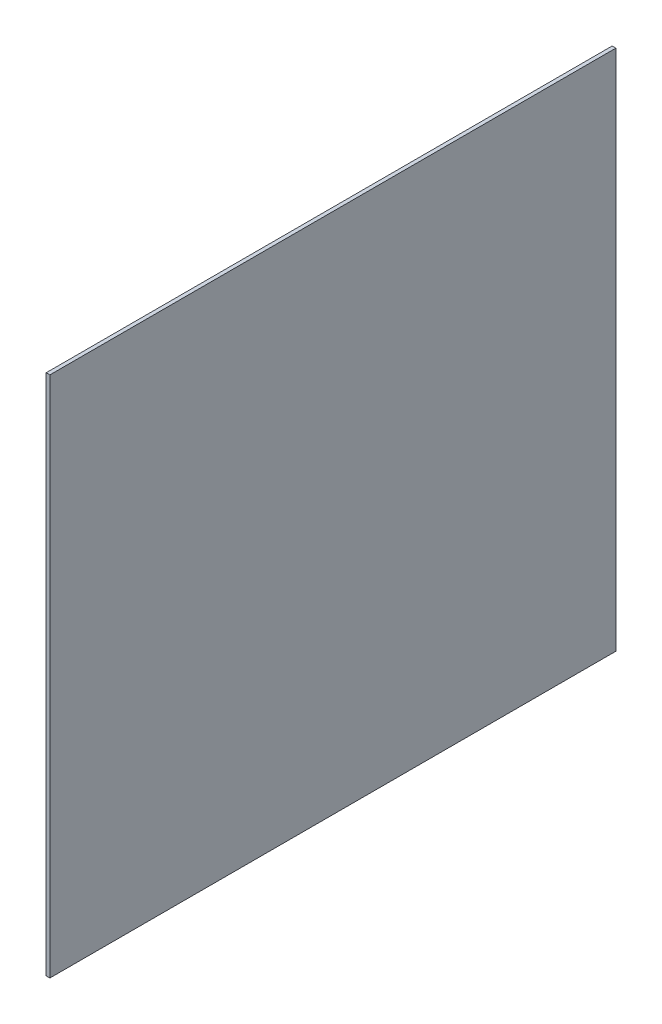
ISO-10303-21;
HEADER;
FILE_DESCRIPTION(('STEP AP214'),'2;1');
FILE_NAME('part.step','',(''),(''),'','','');
FILE_SCHEMA(('AUTOMOTIVE_DESIGN { 1 0 10303 214 1 1 1 1 }'));
ENDSEC;
DATA;
#1=APPLICATION_CONTEXT('core data for automotive mechanical design processes');
#2=APPLICATION_PROTOCOL_DEFINITION('international standard','automotive_design',2000,#1);
#3=PRODUCT_CONTEXT('',#1,'mechanical');
#4=PRODUCT('Part','Part','',(#3));
#5=PRODUCT_RELATED_PRODUCT_CATEGORY('part','',(#4));
#6=PRODUCT_DEFINITION_FORMATION('','',#4);
#7=PRODUCT_DEFINITION_CONTEXT('part definition',#1,'design');
#8=PRODUCT_DEFINITION('design','',#6,#7);
#9=PRODUCT_DEFINITION_SHAPE('','',#8);
#10=(LENGTH_UNIT() NAMED_UNIT(*) SI_UNIT(.MILLI.,.METRE.));
#11=(NAMED_UNIT(*) PLANE_ANGLE_UNIT() SI_UNIT($,.RADIAN.));
#12=(NAMED_UNIT(*) SI_UNIT($,.STERADIAN.) SOLID_ANGLE_UNIT());
#13=UNCERTAINTY_MEASURE_WITH_UNIT(LENGTH_MEASURE(1.E-05),#10,'distance_accuracy_value','');
#14=(GEOMETRIC_REPRESENTATION_CONTEXT(3) GLOBAL_UNCERTAINTY_ASSIGNED_CONTEXT((#13)) GLOBAL_UNIT_ASSIGNED_CONTEXT((#10,
#11,#12)) REPRESENTATION_CONTEXT('',''));
#15=CARTESIAN_POINT('',(0.,0.,0.));
#16=DIRECTION('',(0.,0.,1.));
#17=DIRECTION('',(1.,0.,0.));
#18=AXIS2_PLACEMENT_3D('',#15,#16,#17);
#19=CARTESIAN_POINT('',(3.,211.,-228.6));
#20=DIRECTION('',(0.,0.,1.));
#21=DIRECTION('',(0.,-1.,0.));
#22=AXIS2_PLACEMENT_3D('',#19,#20,#21);
#23=PLANE('',#22);
#24=DIRECTION('',(0.,1.,0.));
#25=VECTOR('',#24,1.);
#26=CARTESIAN_POINT('',(0.,211.,-228.6));
#27=LINE('',#26,#25);
#28=CARTESIAN_POINT('',(0.,-211.,-228.6));
#29=VERTEX_POINT('',#28);
#30=CARTESIAN_POINT('',(0.,211.,-228.6));
#31=VERTEX_POINT('',#30);
#32=EDGE_CURVE('E95',#29,#31,#27,.T.);
#33=ORIENTED_EDGE('',*,*,#32,.T.);
#34=DIRECTION('',(-1.,0.,0.));
#35=VECTOR('',#34,1.);
#36=CARTESIAN_POINT('',(3.,211.,-228.6));
#37=LINE('',#36,#35);
#38=CARTESIAN_POINT('',(3.,211.,-228.6));
#39=VERTEX_POINT('',#38);
#40=EDGE_CURVE('E11',#39,#31,#37,.T.);
#41=ORIENTED_EDGE('',*,*,#40,.F.);
#42=DIRECTION('',(0.,1.,0.));
#43=VECTOR('',#42,1.);
#44=CARTESIAN_POINT('',(3.,211.,-228.6));
#45=LINE('',#44,#43);
#46=CARTESIAN_POINT('',(3.,-211.,-228.6));
#47=VERTEX_POINT('',#46);
#48=EDGE_CURVE('E83',#47,#39,#45,.T.);
#49=ORIENTED_EDGE('',*,*,#48,.F.);
#50=DIRECTION('',(-1.,0.,0.));
#51=VECTOR('',#50,1.);
#52=CARTESIAN_POINT('',(3.,-211.,-228.6));
#53=LINE('',#52,#51);
#54=EDGE_CURVE('E91',#47,#29,#53,.T.);
#55=ORIENTED_EDGE('',*,*,#54,.T.);
#56=EDGE_LOOP('',(#33,#41,#49,#55));
#57=FACE_BOUND('',#56,.T.);
#58=ADVANCED_FACE('F32',(#57),#23,.F.);
#59=CARTESIAN_POINT('',(3.,211.,228.6));
#60=DIRECTION('',(0.,-1.,0.));
#61=DIRECTION('',(0.,0.,-1.));
#62=AXIS2_PLACEMENT_3D('',#59,#60,#61);
#63=PLANE('',#62);
#64=DIRECTION('',(0.,0.,1.));
#65=VECTOR('',#64,1.);
#66=CARTESIAN_POINT('',(0.,211.,228.6));
#67=LINE('',#66,#65);
#68=CARTESIAN_POINT('',(0.,211.,228.6));
#69=VERTEX_POINT('',#68);
#70=EDGE_CURVE('E87',#31,#69,#67,.T.);
#71=ORIENTED_EDGE('',*,*,#70,.T.);
#72=DIRECTION('',(-1.,0.,0.));
#73=VECTOR('',#72,1.);
#74=CARTESIAN_POINT('',(3.,211.,228.6));
#75=LINE('',#74,#73);
#76=CARTESIAN_POINT('',(3.,211.,228.6));
#77=VERTEX_POINT('',#76);
#78=EDGE_CURVE('E40',#77,#69,#75,.T.);
#79=ORIENTED_EDGE('',*,*,#78,.F.);
#80=DIRECTION('',(0.,0.,1.));
#81=VECTOR('',#80,1.);
#82=CARTESIAN_POINT('',(3.,211.,228.6));
#83=LINE('',#82,#81);
#84=EDGE_CURVE('E78',#39,#77,#83,.T.);
#85=ORIENTED_EDGE('',*,*,#84,.F.);
#86=ORIENTED_EDGE('',*,*,#40,.T.);
#87=EDGE_LOOP('',(#71,#79,#85,#86));
#88=FACE_BOUND('',#87,.T.);
#89=ADVANCED_FACE('F86',(#88),#63,.F.);
#90=CARTESIAN_POINT('',(3.,211.,228.6));
#91=DIRECTION('',(0.,0.,-1.));
#92=DIRECTION('',(0.,1.,0.));
#93=AXIS2_PLACEMENT_3D('',#90,#91,#92);
#94=PLANE('',#93);
#95=DIRECTION('',(0.,-1.,0.));
#96=VECTOR('',#95,1.);
#97=CARTESIAN_POINT('',(0.,211.,228.6));
#98=LINE('',#97,#96);
#99=CARTESIAN_POINT('',(0.,-211.,228.6));
#100=VERTEX_POINT('',#99);
#101=EDGE_CURVE('E65',#69,#100,#98,.T.);
#102=ORIENTED_EDGE('',*,*,#101,.T.);
#103=DIRECTION('',(-1.,0.,0.));
#104=VECTOR('',#103,1.);
#105=CARTESIAN_POINT('',(3.,-211.,228.6));
#106=LINE('',#105,#104);
#107=CARTESIAN_POINT('',(3.,-211.,228.6));
#108=VERTEX_POINT('',#107);
#109=EDGE_CURVE('E88',#108,#100,#106,.T.);
#110=ORIENTED_EDGE('',*,*,#109,.F.);
#111=DIRECTION('',(0.,-1.,0.));
#112=VECTOR('',#111,1.);
#113=CARTESIAN_POINT('',(3.,211.,228.6));
#114=LINE('',#113,#112);
#115=EDGE_CURVE('E81',#77,#108,#114,.T.);
#116=ORIENTED_EDGE('',*,*,#115,.F.);
#117=ORIENTED_EDGE('',*,*,#78,.T.);
#118=EDGE_LOOP('',(#102,#110,#116,#117));
#119=FACE_BOUND('',#118,.T.);
#120=ADVANCED_FACE('F89',(#119),#94,.F.);
#121=CARTESIAN_POINT('',(3.,-211.,228.6));
#122=DIRECTION('',(0.,1.,0.));
#123=DIRECTION('',(0.,0.,1.));
#124=AXIS2_PLACEMENT_3D('',#121,#122,#123);
#125=PLANE('',#124);
#126=DIRECTION('',(0.,0.,-1.));
#127=VECTOR('',#126,1.);
#128=CARTESIAN_POINT('',(0.,-211.,228.6));
#129=LINE('',#128,#127);
#130=EDGE_CURVE('E71',#100,#29,#129,.T.);
#131=ORIENTED_EDGE('',*,*,#130,.T.);
#132=ORIENTED_EDGE('',*,*,#54,.F.);
#133=DIRECTION('',(0.,0.,-1.));
#134=VECTOR('',#133,1.);
#135=CARTESIAN_POINT('',(3.,-211.,228.6));
#136=LINE('',#135,#134);
#137=EDGE_CURVE('E48',#108,#47,#136,.T.);
#138=ORIENTED_EDGE('',*,*,#137,.F.);
#139=ORIENTED_EDGE('',*,*,#109,.T.);
#140=EDGE_LOOP('',(#131,#132,#138,#139));
#141=FACE_BOUND('',#140,.T.);
#142=ADVANCED_FACE('F102',(#141),#125,.F.);
#143=CARTESIAN_POINT('',(3.,0.,0.));
#144=DIRECTION('',(1.,0.,0.));
#145=DIRECTION('',(0.,0.,-1.));
#146=AXIS2_PLACEMENT_3D('',#143,#144,#145);
#147=PLANE('',#146);
#148=ORIENTED_EDGE('',*,*,#48,.T.);
#149=ORIENTED_EDGE('',*,*,#84,.T.);
#150=ORIENTED_EDGE('',*,*,#115,.T.);
#151=ORIENTED_EDGE('',*,*,#137,.T.);
#152=EDGE_LOOP('',(#148,#149,#150,#151));
#153=FACE_BOUND('',#152,.T.);
#154=ADVANCED_FACE('F79',(#153),#147,.T.);
#155=CARTESIAN_POINT('',(0.,0.,0.));
#156=DIRECTION('',(1.,0.,0.));
#157=DIRECTION('',(0.,0.,-1.));
#158=AXIS2_PLACEMENT_3D('',#155,#156,#157);
#159=PLANE('',#158);
#160=ORIENTED_EDGE('',*,*,#32,.F.);
#161=ORIENTED_EDGE('',*,*,#130,.F.);
#162=ORIENTED_EDGE('',*,*,#101,.F.);
#163=ORIENTED_EDGE('',*,*,#70,.F.);
#164=EDGE_LOOP('',(#160,#161,#162,#163));
#165=FACE_BOUND('',#164,.T.);
#166=ADVANCED_FACE('F105',(#165),#159,.F.);
#167=CLOSED_SHELL('',(#58,#89,#120,#142,#154,#166));
#168=MANIFOLD_SOLID_BREP('B2',#167);
#169=ADVANCED_BREP_SHAPE_REPRESENTATION('',(#18,#168),#14);
#170=SHAPE_DEFINITION_REPRESENTATION(#9,#169);
ENDSEC;
END-ISO-10303-21;
